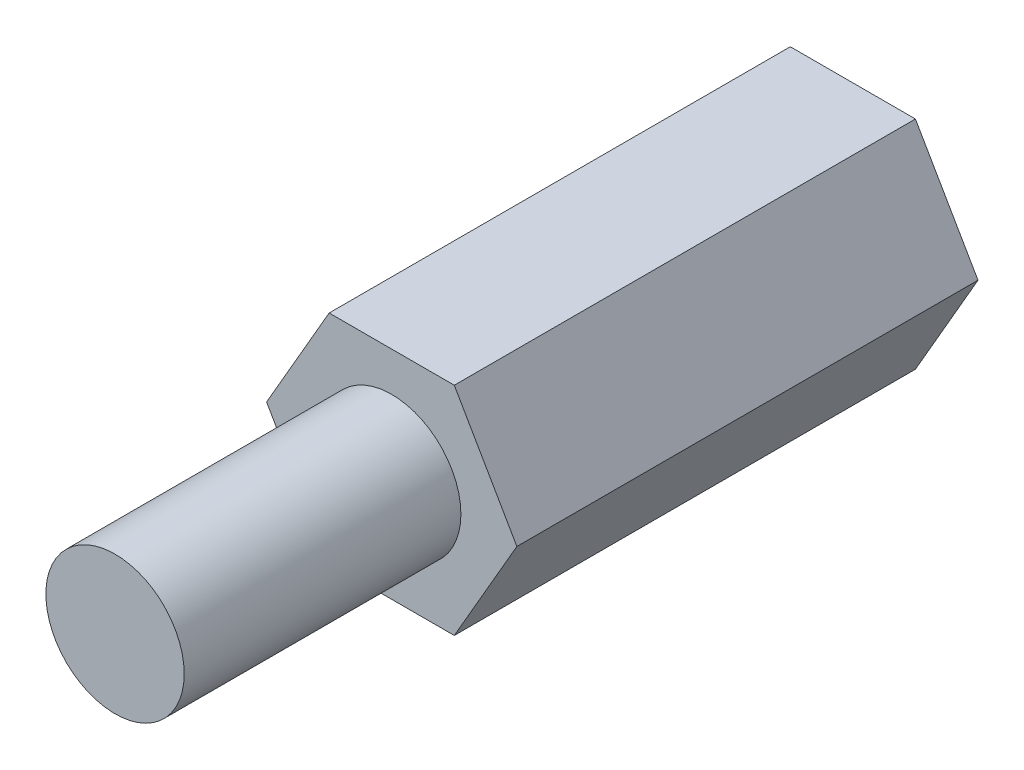
ISO-10303-21;
HEADER;
FILE_DESCRIPTION(('STEP AP214'),'2;1');
FILE_NAME('part.step','',(''),(''),'','','');
FILE_SCHEMA(('AUTOMOTIVE_DESIGN { 1 0 10303 214 1 1 1 1 }'));
ENDSEC;
DATA;
#1=APPLICATION_CONTEXT('core data for automotive mechanical design processes');
#2=APPLICATION_PROTOCOL_DEFINITION('international standard','automotive_design',2000,#1);
#3=PRODUCT_CONTEXT('',#1,'mechanical');
#4=PRODUCT('Part','Part','',(#3));
#5=PRODUCT_RELATED_PRODUCT_CATEGORY('part','',(#4));
#6=PRODUCT_DEFINITION_FORMATION('','',#4);
#7=PRODUCT_DEFINITION_CONTEXT('part definition',#1,'design');
#8=PRODUCT_DEFINITION('design','',#6,#7);
#9=PRODUCT_DEFINITION_SHAPE('','',#8);
#10=(LENGTH_UNIT() NAMED_UNIT(*) SI_UNIT(.MILLI.,.METRE.));
#11=(NAMED_UNIT(*) PLANE_ANGLE_UNIT() SI_UNIT($,.RADIAN.));
#12=(NAMED_UNIT(*) SI_UNIT($,.STERADIAN.) SOLID_ANGLE_UNIT());
#13=UNCERTAINTY_MEASURE_WITH_UNIT(LENGTH_MEASURE(1.E-05),#10,'distance_accuracy_value','');
#14=(GEOMETRIC_REPRESENTATION_CONTEXT(3) GLOBAL_UNCERTAINTY_ASSIGNED_CONTEXT((#13)) GLOBAL_UNIT_ASSIGNED_CONTEXT((#10,
#11,#12)) REPRESENTATION_CONTEXT('',''));
#15=CARTESIAN_POINT('',(0.,0.,0.));
#16=DIRECTION('',(0.,0.,1.));
#17=DIRECTION('',(1.,0.,0.));
#18=AXIS2_PLACEMENT_3D('',#15,#16,#17);
#19=CARTESIAN_POINT('',(1.35677313259565,-2.34999999999999,10.));
#20=DIRECTION('',(-0.866025403784442,0.499999999999995,0.));
#21=DIRECTION('',(-0.499999999999995,-0.866025403784442,0.));
#22=AXIS2_PLACEMENT_3D('',#19,#20,#21);
#23=PLANE('',#22);
#24=DIRECTION('',(0.499999999999995,0.866025403784442,0.));
#25=VECTOR('',#24,1.);
#26=CARTESIAN_POINT('',(1.35677313259565,-2.34999999999999,0.));
#27=LINE('',#26,#25);
#28=CARTESIAN_POINT('',(1.35677313259565,-2.34999999999999,0.));
#29=VERTEX_POINT('',#28);
#30=CARTESIAN_POINT('',(2.71354626519124,0.,0.));
#31=VERTEX_POINT('',#30);
#32=EDGE_CURVE('E132',#29,#31,#27,.T.);
#33=ORIENTED_EDGE('',*,*,#32,.T.);
#34=DIRECTION('',(0.,0.,-1.));
#35=VECTOR('',#34,1.);
#36=CARTESIAN_POINT('',(2.71354626519124,0.,10.));
#37=LINE('',#36,#35);
#38=CARTESIAN_POINT('',(2.71354626519124,0.,10.));
#39=VERTEX_POINT('',#38);
#40=EDGE_CURVE('E44',#39,#31,#37,.T.);
#41=ORIENTED_EDGE('',*,*,#40,.F.);
#42=DIRECTION('',(0.499999999999995,0.866025403784442,0.));
#43=VECTOR('',#42,1.);
#44=CARTESIAN_POINT('',(1.35677313259565,-2.34999999999999,10.));
#45=LINE('',#44,#43);
#46=CARTESIAN_POINT('',(1.35677313259565,-2.34999999999999,10.));
#47=VERTEX_POINT('',#46);
#48=EDGE_CURVE('E149',#47,#39,#45,.T.);
#49=ORIENTED_EDGE('',*,*,#48,.F.);
#50=DIRECTION('',(0.,0.,-1.));
#51=VECTOR('',#50,1.);
#52=CARTESIAN_POINT('',(1.35677313259565,-2.34999999999999,10.));
#53=LINE('',#52,#51);
#54=EDGE_CURVE('E128',#47,#29,#53,.T.);
#55=ORIENTED_EDGE('',*,*,#54,.T.);
#56=EDGE_LOOP('',(#33,#41,#49,#55));
#57=FACE_BOUND('',#56,.T.);
#58=ADVANCED_FACE('F41',(#57),#23,.F.);
#59=CARTESIAN_POINT('',(2.71354626519124,0.,10.));
#60=DIRECTION('',(-0.866025403784438,-0.500000000000001,0.));
#61=DIRECTION('',(0.500000000000001,-0.866025403784438,0.));
#62=AXIS2_PLACEMENT_3D('',#59,#60,#61);
#63=PLANE('',#62);
#64=DIRECTION('',(-0.500000000000001,0.866025403784438,0.));
#65=VECTOR('',#64,1.);
#66=CARTESIAN_POINT('',(2.71354626519124,0.,0.));
#67=LINE('',#66,#65);
#68=CARTESIAN_POINT('',(1.35677313259562,2.35000000000001,0.));
#69=VERTEX_POINT('',#68);
#70=EDGE_CURVE('E136',#31,#69,#67,.T.);
#71=ORIENTED_EDGE('',*,*,#70,.T.);
#72=DIRECTION('',(0.,0.,-1.));
#73=VECTOR('',#72,1.);
#74=CARTESIAN_POINT('',(1.35677313259562,2.35000000000001,10.));
#75=LINE('',#74,#73);
#76=CARTESIAN_POINT('',(1.35677313259562,2.35000000000001,10.));
#77=VERTEX_POINT('',#76);
#78=EDGE_CURVE('E155',#77,#69,#75,.T.);
#79=ORIENTED_EDGE('',*,*,#78,.F.);
#80=DIRECTION('',(-0.500000000000001,0.866025403784438,0.));
#81=VECTOR('',#80,1.);
#82=CARTESIAN_POINT('',(2.71354626519124,0.,10.));
#83=LINE('',#82,#81);
#84=EDGE_CURVE('E97',#39,#77,#83,.T.);
#85=ORIENTED_EDGE('',*,*,#84,.F.);
#86=ORIENTED_EDGE('',*,*,#40,.T.);
#87=EDGE_LOOP('',(#71,#79,#85,#86));
#88=FACE_BOUND('',#87,.T.);
#89=ADVANCED_FACE('F162',(#88),#63,.F.);
#90=CARTESIAN_POINT('',(1.35677313259562,2.35000000000001,10.));
#91=DIRECTION('',(0.,-1.,0.));
#92=DIRECTION('',(1.,0.,0.));
#93=AXIS2_PLACEMENT_3D('',#90,#91,#92);
#94=PLANE('',#93);
#95=DIRECTION('',(-1.,0.,0.));
#96=VECTOR('',#95,1.);
#97=CARTESIAN_POINT('',(1.35677313259562,2.35000000000001,0.));
#98=LINE('',#97,#96);
#99=CARTESIAN_POINT('',(-1.35677313259563,2.35,0.));
#100=VERTEX_POINT('',#99);
#101=EDGE_CURVE('E140',#69,#100,#98,.T.);
#102=ORIENTED_EDGE('',*,*,#101,.T.);
#103=DIRECTION('',(0.,0.,-1.));
#104=VECTOR('',#103,1.);
#105=CARTESIAN_POINT('',(-1.35677313259563,2.35,10.));
#106=LINE('',#105,#104);
#107=CARTESIAN_POINT('',(-1.35677313259563,2.35,10.));
#108=VERTEX_POINT('',#107);
#109=EDGE_CURVE('E121',#108,#100,#106,.T.);
#110=ORIENTED_EDGE('',*,*,#109,.F.);
#111=DIRECTION('',(-1.,0.,0.));
#112=VECTOR('',#111,1.);
#113=CARTESIAN_POINT('',(1.35677313259562,2.35000000000001,10.));
#114=LINE('',#113,#112);
#115=EDGE_CURVE('E110',#77,#108,#114,.T.);
#116=ORIENTED_EDGE('',*,*,#115,.F.);
#117=ORIENTED_EDGE('',*,*,#78,.T.);
#118=EDGE_LOOP('',(#102,#110,#116,#117));
#119=FACE_BOUND('',#118,.T.);
#120=ADVANCED_FACE('F168',(#119),#94,.F.);
#121=CARTESIAN_POINT('',(-1.35677313259563,2.35,10.));
#122=DIRECTION('',(0.866025403784442,-0.499999999999995,0.));
#123=DIRECTION('',(0.499999999999995,0.866025403784442,0.));
#124=AXIS2_PLACEMENT_3D('',#121,#122,#123);
#125=PLANE('',#124);
#126=DIRECTION('',(-0.499999999999995,-0.866025403784441,0.));
#127=VECTOR('',#126,1.);
#128=CARTESIAN_POINT('',(-1.35677313259563,2.35,0.));
#129=LINE('',#128,#127);
#130=CARTESIAN_POINT('',(-2.71354626519124,0.,0.));
#131=VERTEX_POINT('',#130);
#132=EDGE_CURVE('E119',#100,#131,#129,.T.);
#133=ORIENTED_EDGE('',*,*,#132,.T.);
#134=DIRECTION('',(0.,0.,-1.));
#135=VECTOR('',#134,1.);
#136=CARTESIAN_POINT('',(-2.71354626519124,0.,10.));
#137=LINE('',#136,#135);
#138=CARTESIAN_POINT('',(-2.71354626519124,0.,10.));
#139=VERTEX_POINT('',#138);
#140=EDGE_CURVE('E116',#139,#131,#137,.T.);
#141=ORIENTED_EDGE('',*,*,#140,.F.);
#142=DIRECTION('',(-0.499999999999995,-0.866025403784441,0.));
#143=VECTOR('',#142,1.);
#144=CARTESIAN_POINT('',(-1.35677313259563,2.35,10.));
#145=LINE('',#144,#143);
#146=EDGE_CURVE('E104',#108,#139,#145,.T.);
#147=ORIENTED_EDGE('',*,*,#146,.F.);
#148=ORIENTED_EDGE('',*,*,#109,.T.);
#149=EDGE_LOOP('',(#133,#141,#147,#148));
#150=FACE_BOUND('',#149,.T.);
#151=ADVANCED_FACE('F117',(#150),#125,.F.);
#152=CARTESIAN_POINT('',(-2.71354626519124,0.,10.));
#153=DIRECTION('',(0.866025403784434,0.500000000000007,0.));
#154=DIRECTION('',(-0.500000000000007,0.866025403784435,0.));
#155=AXIS2_PLACEMENT_3D('',#152,#153,#154);
#156=PLANE('',#155);
#157=DIRECTION('',(0.500000000000007,-0.866025403784434,0.));
#158=VECTOR('',#157,1.);
#159=CARTESIAN_POINT('',(-2.71354626519124,0.,0.));
#160=LINE('',#159,#158);
#161=CARTESIAN_POINT('',(-1.3567731325956,-2.35000000000001,0.));
#162=VERTEX_POINT('',#161);
#163=EDGE_CURVE('E82',#131,#162,#160,.T.);
#164=ORIENTED_EDGE('',*,*,#163,.T.);
#165=DIRECTION('',(0.,0.,-1.));
#166=VECTOR('',#165,1.);
#167=CARTESIAN_POINT('',(-1.3567731325956,-2.35000000000001,10.));
#168=LINE('',#167,#166);
#169=CARTESIAN_POINT('',(-1.3567731325956,-2.35000000000001,10.));
#170=VERTEX_POINT('',#169);
#171=EDGE_CURVE('E122',#170,#162,#168,.T.);
#172=ORIENTED_EDGE('',*,*,#171,.F.);
#173=DIRECTION('',(0.500000000000007,-0.866025403784434,0.));
#174=VECTOR('',#173,1.);
#175=CARTESIAN_POINT('',(-2.71354626519124,0.,10.));
#176=LINE('',#175,#174);
#177=EDGE_CURVE('E108',#139,#170,#176,.T.);
#178=ORIENTED_EDGE('',*,*,#177,.F.);
#179=ORIENTED_EDGE('',*,*,#140,.T.);
#180=EDGE_LOOP('',(#164,#172,#178,#179));
#181=FACE_BOUND('',#180,.T.);
#182=ADVANCED_FACE('F124',(#181),#156,.F.);
#183=CARTESIAN_POINT('',(-1.3567731325956,-2.35000000000001,10.));
#184=DIRECTION('',(0.,1.,0.));
#185=DIRECTION('',(-1.,0.,0.));
#186=AXIS2_PLACEMENT_3D('',#183,#184,#185);
#187=PLANE('',#186);
#188=DIRECTION('',(1.,0.,0.));
#189=VECTOR('',#188,1.);
#190=CARTESIAN_POINT('',(-1.3567731325956,-2.35000000000001,0.));
#191=LINE('',#190,#189);
#192=EDGE_CURVE('E88',#162,#29,#191,.T.);
#193=ORIENTED_EDGE('',*,*,#192,.T.);
#194=ORIENTED_EDGE('',*,*,#54,.F.);
#195=DIRECTION('',(1.,0.,0.));
#196=VECTOR('',#195,1.);
#197=CARTESIAN_POINT('',(-1.3567731325956,-2.35000000000001,10.));
#198=LINE('',#197,#196);
#199=EDGE_CURVE('E59',#170,#47,#198,.T.);
#200=ORIENTED_EDGE('',*,*,#199,.F.);
#201=ORIENTED_EDGE('',*,*,#171,.T.);
#202=EDGE_LOOP('',(#193,#194,#200,#201));
#203=FACE_BOUND('',#202,.T.);
#204=ADVANCED_FACE('F205',(#203),#187,.F.);
#205=CARTESIAN_POINT('',(0.,0.,10.));
#206=DIRECTION('',(0.,0.,1.));
#207=DIRECTION('',(1.,0.,0.));
#208=AXIS2_PLACEMENT_3D('',#205,#206,#207);
#209=PLANE('',#208);
#210=CARTESIAN_POINT('',(0.,0.,10.));
#211=DIRECTION('',(0.,0.,1.));
#212=DIRECTION('',(1.,0.,0.));
#213=AXIS2_PLACEMENT_3D('',#210,#211,#212);
#214=CIRCLE('',#213,1.5);
#215=CARTESIAN_POINT('',(1.5,0.,10.));
#216=VERTEX_POINT('',#215);
#217=EDGE_CURVE('E11',#216,#216,#214,.T.);
#218=ORIENTED_EDGE('',*,*,#217,.F.);
#219=EDGE_LOOP('',(#218));
#220=FACE_BOUND('',#219,.T.);
#221=ORIENTED_EDGE('',*,*,#48,.T.);
#222=ORIENTED_EDGE('',*,*,#84,.T.);
#223=ORIENTED_EDGE('',*,*,#115,.T.);
#224=ORIENTED_EDGE('',*,*,#146,.T.);
#225=ORIENTED_EDGE('',*,*,#177,.T.);
#226=ORIENTED_EDGE('',*,*,#199,.T.);
#227=EDGE_LOOP('',(#221,#222,#223,#224,#225,#226));
#228=FACE_BOUND('',#227,.T.);
#229=ADVANCED_FACE('F106',(#220,#228),#209,.T.);
#230=CARTESIAN_POINT('',(0.,0.,0.));
#231=DIRECTION('',(0.,0.,1.));
#232=DIRECTION('',(1.,0.,0.));
#233=AXIS2_PLACEMENT_3D('',#230,#231,#232);
#234=PLANE('',#233);
#235=CARTESIAN_POINT('',(0.,0.,0.));
#236=DIRECTION('',(0.,0.,-1.));
#237=DIRECTION('',(-1.,0.,0.));
#238=AXIS2_PLACEMENT_3D('',#235,#236,#237);
#239=CIRCLE('',#238,1.5);
#240=CARTESIAN_POINT('',(-1.5,0.,0.));
#241=VERTEX_POINT('',#240);
#242=EDGE_CURVE('E179',#241,#241,#239,.T.);
#243=ORIENTED_EDGE('',*,*,#242,.F.);
#244=EDGE_LOOP('',(#243));
#245=FACE_BOUND('',#244,.T.);
#246=ORIENTED_EDGE('',*,*,#32,.F.);
#247=ORIENTED_EDGE('',*,*,#192,.F.);
#248=ORIENTED_EDGE('',*,*,#163,.F.);
#249=ORIENTED_EDGE('',*,*,#132,.F.);
#250=ORIENTED_EDGE('',*,*,#101,.F.);
#251=ORIENTED_EDGE('',*,*,#70,.F.);
#252=EDGE_LOOP('',(#246,#247,#248,#249,#250,#251));
#253=FACE_BOUND('',#252,.T.);
#254=ADVANCED_FACE('F167',(#245,#253),#234,.F.);
#255=CARTESIAN_POINT('',(0.,0.,16.));
#256=DIRECTION('',(0.,0.,-1.));
#257=DIRECTION('',(-1.,0.,0.));
#258=AXIS2_PLACEMENT_3D('',#255,#256,#257);
#259=CYLINDRICAL_SURFACE('',#258,1.5);
#260=CARTESIAN_POINT('',(0.,0.,16.));
#261=DIRECTION('',(0.,0.,1.));
#262=DIRECTION('',(1.,0.,0.));
#263=AXIS2_PLACEMENT_3D('',#260,#261,#262);
#264=CIRCLE('',#263,1.5);
#265=CARTESIAN_POINT('',(1.5,0.,16.));
#266=VERTEX_POINT('',#265);
#267=EDGE_CURVE('E137',#266,#266,#264,.T.);
#268=ORIENTED_EDGE('',*,*,#267,.F.);
#269=EDGE_LOOP('',(#268));
#270=FACE_BOUND('',#269,.T.);
#271=ORIENTED_EDGE('',*,*,#217,.T.);
#272=EDGE_LOOP('',(#271));
#273=FACE_BOUND('',#272,.T.);
#274=ADVANCED_FACE('F197',(#270,#273),#259,.T.);
#275=CARTESIAN_POINT('',(0.,0.,16.));
#276=DIRECTION('',(0.,0.,1.));
#277=DIRECTION('',(1.,0.,0.));
#278=AXIS2_PLACEMENT_3D('',#275,#276,#277);
#279=PLANE('',#278);
#280=ORIENTED_EDGE('',*,*,#267,.T.);
#281=EDGE_LOOP('',(#280));
#282=FACE_BOUND('',#281,.T.);
#283=ADVANCED_FACE('F192',(#282),#279,.T.);
#284=CARTESIAN_POINT('',(0.,0.,6.));
#285=DIRECTION('',(0.,0.,-1.));
#286=DIRECTION('',(-1.,0.,0.));
#287=AXIS2_PLACEMENT_3D('',#284,#285,#286);
#288=CYLINDRICAL_SURFACE('',#287,1.5);
#289=CARTESIAN_POINT('',(0.,0.,6.));
#290=DIRECTION('',(0.,0.,-1.));
#291=DIRECTION('',(-1.,0.,0.));
#292=AXIS2_PLACEMENT_3D('',#289,#290,#291);
#293=CIRCLE('',#292,1.5);
#294=CARTESIAN_POINT('',(-1.5,0.,6.));
#295=VERTEX_POINT('',#294);
#296=EDGE_CURVE('E178',#295,#295,#293,.T.);
#297=ORIENTED_EDGE('',*,*,#296,.F.);
#298=EDGE_LOOP('',(#297));
#299=FACE_BOUND('',#298,.T.);
#300=ORIENTED_EDGE('',*,*,#242,.T.);
#301=EDGE_LOOP('',(#300));
#302=FACE_BOUND('',#301,.T.);
#303=ADVANCED_FACE('F189',(#299,#302),#288,.F.);
#304=CARTESIAN_POINT('',(0.,0.,6.));
#305=DIRECTION('',(0.,0.,-1.));
#306=DIRECTION('',(-1.,0.,0.));
#307=AXIS2_PLACEMENT_3D('',#304,#305,#306);
#308=PLANE('',#307);
#309=ORIENTED_EDGE('',*,*,#296,.T.);
#310=EDGE_LOOP('',(#309));
#311=FACE_BOUND('',#310,.T.);
#312=ADVANCED_FACE('F187',(#311),#308,.T.);
#313=CLOSED_SHELL('',(#58,#89,#120,#151,#182,#204,#229,#254,#274,#283,#303,#312));
#314=MANIFOLD_SOLID_BREP('B2',#313);
#315=ADVANCED_BREP_SHAPE_REPRESENTATION('',(#18,#314),#14);
#316=SHAPE_DEFINITION_REPRESENTATION(#9,#315);
ENDSEC;
END-ISO-10303-21;
